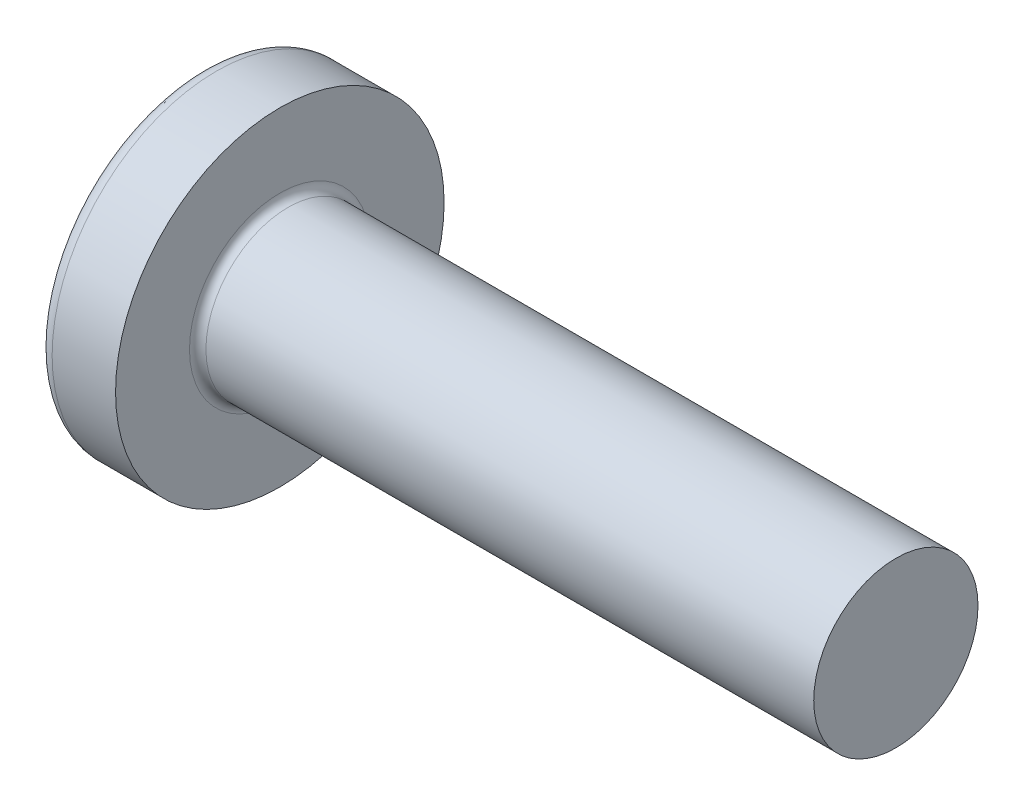
ISO-10303-21;
HEADER;
FILE_DESCRIPTION(('STEP AP214'),'2;1');
FILE_NAME('part.step','',(''),(''),'','','');
FILE_SCHEMA(('AUTOMOTIVE_DESIGN { 1 0 10303 214 1 1 1 1 }'));
ENDSEC;
DATA;
#1=APPLICATION_CONTEXT('core data for automotive mechanical design processes');
#2=APPLICATION_PROTOCOL_DEFINITION('international standard','automotive_design',2000,#1);
#3=PRODUCT_CONTEXT('',#1,'mechanical');
#4=PRODUCT('Part','Part','',(#3));
#5=PRODUCT_RELATED_PRODUCT_CATEGORY('part','',(#4));
#6=PRODUCT_DEFINITION_FORMATION('','',#4);
#7=PRODUCT_DEFINITION_CONTEXT('part definition',#1,'design');
#8=PRODUCT_DEFINITION('design','',#6,#7);
#9=PRODUCT_DEFINITION_SHAPE('','',#8);
#10=(LENGTH_UNIT() NAMED_UNIT(*) SI_UNIT(.MILLI.,.METRE.));
#11=(NAMED_UNIT(*) PLANE_ANGLE_UNIT() SI_UNIT($,.RADIAN.));
#12=(NAMED_UNIT(*) SI_UNIT($,.STERADIAN.) SOLID_ANGLE_UNIT());
#13=UNCERTAINTY_MEASURE_WITH_UNIT(LENGTH_MEASURE(1.E-05),#10,'distance_accuracy_value','');
#14=(GEOMETRIC_REPRESENTATION_CONTEXT(3) GLOBAL_UNCERTAINTY_ASSIGNED_CONTEXT((#13)) GLOBAL_UNIT_ASSIGNED_CONTEXT((#10,
#11,#12)) REPRESENTATION_CONTEXT('',''));
#15=CARTESIAN_POINT('',(0.,0.,0.));
#16=DIRECTION('',(0.,0.,1.));
#17=DIRECTION('',(1.,0.,0.));
#18=AXIS2_PLACEMENT_3D('',#15,#16,#17);
#19=CARTESIAN_POINT('',(6.5,0.,0.));
#20=DIRECTION('',(-1.,0.,0.));
#21=DIRECTION('',(0.,1.,0.));
#22=AXIS2_PLACEMENT_3D('',#19,#20,#21);
#23=SPHERICAL_SURFACE('',#22,6.5);
#24=CARTESIAN_POINT('',(1.26538895452803,0.,0.));
#25=DIRECTION('',(-1.,0.,0.));
#26=DIRECTION('',(0.,0.,1.));
#27=AXIS2_PLACEMENT_3D('',#24,#25,#26);
#28=CIRCLE('',#27,3.85342019543974);
#29=CARTESIAN_POINT('',(1.26538895452803,0.,3.85342019543974));
#30=VERTEX_POINT('',#29);
#31=EDGE_CURVE('E356',#30,#30,#28,.T.);
#32=ORIENTED_EDGE('',*,*,#31,.T.);
#33=EDGE_LOOP('',(#32));
#34=FACE_BOUND('',#33,.T.);
#35=CARTESIAN_POINT('',(0.0788099820016241,0.,0.));
#36=DIRECTION('',(1.,0.,0.));
#37=DIRECTION('',(0.,0.,-1.));
#38=AXIS2_PLACEMENT_3D('',#35,#36,#37);
#39=CIRCLE('',#38,1.0091178091571);
#40=CARTESIAN_POINT('',(0.0788099820016238,-0.514999999999996,-0.867809744562728));
#41=VERTEX_POINT('',#40);
#42=CARTESIAN_POINT('',(0.0788099820016241,-0.867809744562729,-0.515));
#43=VERTEX_POINT('',#42);
#44=EDGE_CURVE('E236',#41,#43,#39,.F.);
#45=ORIENTED_EDGE('',*,*,#44,.F.);
#46=CARTESIAN_POINT('',(6.5,-0.515,0.));
#47=DIRECTION('',(0.,1.,0.));
#48=DIRECTION('',(0.,0.,1.));
#49=AXIS2_PLACEMENT_3D('',#46,#47,#48);
#50=CIRCLE('',#49,6.47956595768575);
#51=CARTESIAN_POINT('',(0.331830520157864,-0.514999999999992,-1.98455543332606));
#52=VERTEX_POINT('',#51);
#53=EDGE_CURVE('E345',#52,#41,#50,.T.);
#54=ORIENTED_EDGE('',*,*,#53,.F.);
#55=CARTESIAN_POINT('',(6.06443225879636,0.,0.873613881877686));
#56=DIRECTION('',(0.446197753347362,0.,-0.89493439139848));
#57=DIRECTION('',(-0.89493439139848,0.,-0.446197753347362));
#58=AXIS2_PLACEMENT_3D('',#55,#56,#57);
#59=CIRCLE('',#58,6.42628038045441);
#60=CARTESIAN_POINT('',(0.331830520157865,0.515000000000007,-1.98455543332606));
#61=VERTEX_POINT('',#60);
#62=EDGE_CURVE('E315',#52,#61,#59,.T.);
#63=ORIENTED_EDGE('',*,*,#62,.T.);
#64=CARTESIAN_POINT('',(6.5,0.515,0.));
#65=DIRECTION('',(0.,-1.,0.));
#66=DIRECTION('',(0.,0.,-1.));
#67=AXIS2_PLACEMENT_3D('',#64,#65,#66);
#68=CIRCLE('',#67,6.47956595768574);
#69=CARTESIAN_POINT('',(0.0788099820016253,0.515000000000003,-0.867809744562724));
#70=VERTEX_POINT('',#69);
#71=EDGE_CURVE('E351',#70,#61,#68,.T.);
#72=ORIENTED_EDGE('',*,*,#71,.F.);
#73=CARTESIAN_POINT('',(0.0788099820016241,0.867809744562719,-0.515));
#74=VERTEX_POINT('',#73);
#75=EDGE_CURVE('E242',#74,#70,#39,.F.);
#76=ORIENTED_EDGE('',*,*,#75,.F.);
#77=CARTESIAN_POINT('',(6.5,0.,-0.515));
#78=DIRECTION('',(0.,0.,1.));
#79=DIRECTION('',(1.,0.,0.));
#80=AXIS2_PLACEMENT_3D('',#77,#78,#79);
#81=CIRCLE('',#80,6.47956595768574);
#82=CARTESIAN_POINT('',(0.331830520157846,1.984555433326,-0.515));
#83=VERTEX_POINT('',#82);
#84=EDGE_CURVE('E410',#83,#74,#81,.T.);
#85=ORIENTED_EDGE('',*,*,#84,.F.);
#86=CARTESIAN_POINT('',(6.06443225879571,-0.873613881878621,0.));
#87=DIRECTION('',(0.44619775334751,0.894934391398406,0.));
#88=DIRECTION('',(-0.894934391398405,0.44619775334751,0.));
#89=AXIS2_PLACEMENT_3D('',#86,#87,#88);
#90=CIRCLE('',#89,6.42628038045425);
#91=CARTESIAN_POINT('',(0.331830520157847,1.984555433326,0.514999999999999));
#92=VERTEX_POINT('',#91);
#93=EDGE_CURVE('E414',#83,#92,#90,.T.);
#94=ORIENTED_EDGE('',*,*,#93,.T.);
#95=CARTESIAN_POINT('',(6.5,0.,0.515));
#96=DIRECTION('',(0.,0.,-1.));
#97=DIRECTION('',(0.,1.,0.));
#98=AXIS2_PLACEMENT_3D('',#95,#96,#97);
#99=CIRCLE('',#98,6.47956595768574);
#100=CARTESIAN_POINT('',(0.0788099820016241,0.867809744562719,0.515));
#101=VERTEX_POINT('',#100);
#102=EDGE_CURVE('E405',#101,#92,#99,.T.);
#103=ORIENTED_EDGE('',*,*,#102,.F.);
#104=CARTESIAN_POINT('',(0.0788099820016247,0.514999999999997,0.867809744562727));
#105=VERTEX_POINT('',#104);
#106=EDGE_CURVE('E241',#105,#101,#39,.F.);
#107=ORIENTED_EDGE('',*,*,#106,.F.);
#108=CARTESIAN_POINT('',(0.331830520157846,0.514999999999993,1.984555433326));
#109=VERTEX_POINT('',#108);
#110=EDGE_CURVE('E347',#109,#105,#68,.T.);
#111=ORIENTED_EDGE('',*,*,#110,.F.);
#112=CARTESIAN_POINT('',(6.06443225879571,0.,-0.87361388187862));
#113=DIRECTION('',(0.44619775334751,0.,0.894934391398406));
#114=DIRECTION('',(0.894934391398405,0.,-0.44619775334751));
#115=AXIS2_PLACEMENT_3D('',#112,#113,#114);
#116=CIRCLE('',#115,6.42628038045424);
#117=CARTESIAN_POINT('',(0.331830520157846,-0.515000000000006,1.984555433326));
#118=VERTEX_POINT('',#117);
#119=EDGE_CURVE('E59',#109,#118,#116,.T.);
#120=ORIENTED_EDGE('',*,*,#119,.T.);
#121=CARTESIAN_POINT('',(0.0788099820016244,-0.515000000000003,0.867809744562724));
#122=VERTEX_POINT('',#121);
#123=EDGE_CURVE('E342',#122,#118,#50,.T.);
#124=ORIENTED_EDGE('',*,*,#123,.F.);
#125=CARTESIAN_POINT('',(0.0788099820016241,-0.867809744562729,0.514999999999999));
#126=VERTEX_POINT('',#125);
#127=EDGE_CURVE('E282',#126,#122,#39,.F.);
#128=ORIENTED_EDGE('',*,*,#127,.F.);
#129=CARTESIAN_POINT('',(0.331830520157862,-1.98455543332606,0.514999999999999));
#130=VERTEX_POINT('',#129);
#131=EDGE_CURVE('E406',#130,#126,#99,.T.);
#132=ORIENTED_EDGE('',*,*,#131,.F.);
#133=CARTESIAN_POINT('',(6.06443225879636,0.873613881877685,0.));
#134=DIRECTION('',(0.446197753347362,-0.89493439139848,0.));
#135=DIRECTION('',(0.89493439139848,0.446197753347362,0.));
#136=AXIS2_PLACEMENT_3D('',#133,#134,#135);
#137=CIRCLE('',#136,6.42628038045441);
#138=CARTESIAN_POINT('',(0.331830520157863,-1.98455543332606,-0.515));
#139=VERTEX_POINT('',#138);
#140=EDGE_CURVE('E401',#130,#139,#137,.T.);
#141=ORIENTED_EDGE('',*,*,#140,.T.);
#142=EDGE_CURVE('E74',#43,#139,#81,.T.);
#143=ORIENTED_EDGE('',*,*,#142,.F.);
#144=EDGE_LOOP('',(#45,#54,#63,#72,#76,#85,#94,#103,#107,#111,#120,#124,#128,#132,#141,#143));
#145=FACE_BOUND('',#144,.T.);
#146=ADVANCED_FACE('F44',(#34,#145),#23,.T.);
#147=CARTESIAN_POINT('',(0.,2.15,-0.515));
#148=DIRECTION('',(0.,0.,1.));
#149=DIRECTION('',(1.,0.,0.));
#150=AXIS2_PLACEMENT_3D('',#147,#148,#149);
#151=PLANE('',#150);
#152=ORIENTED_EDGE('',*,*,#84,.T.);
#153=CARTESIAN_POINT('',(-1.51195208675156,0.994972220320188,-0.515));
#154=CARTESIAN_POINT('',(-1.20405981949279,0.970722016949958,-0.515));
#155=CARTESIAN_POINT('',(-0.896180907521173,0.946299109919651,-0.515));
#156=CARTESIAN_POINT('',(-0.280449079832185,0.896981122427851,-0.515));
#157=CARTESIAN_POINT('',(0.0274038344396874,0.872086023934883,-0.515));
#158=CARTESIAN_POINT('',(0.489146739515351,0.83429553519528,-0.515));
#159=CARTESIAN_POINT('',(0.643055047553846,0.821624058404092,-0.515));
#160=CARTESIAN_POINT('',(0.950856520197141,0.796108332639504,-0.515));
#161=CARTESIAN_POINT('',(1.10474968487868,0.783264084592465,-0.515));
#162=CARTESIAN_POINT('',(1.41251352095103,0.757376569093378,-0.515));
#163=CARTESIAN_POINT('',(1.56638419296577,0.744333309065218,-0.515));
#164=CARTESIAN_POINT('',(1.87410847343335,0.718013273188896,-0.515));
#165=CARTESIAN_POINT('',(2.02796208151372,0.704736492982792,-0.515));
#166=CARTESIAN_POINT('',(2.36455311890989,0.675386943006726,-0.515));
#167=CARTESIAN_POINT('',(2.54728562293342,0.659257575640986,-0.515));
#168=CARTESIAN_POINT('',(2.91270624109256,0.626517182479888,-0.515));
#169=CARTESIAN_POINT('',(3.09539435554038,0.609906160177238,-0.515));
#170=CARTESIAN_POINT('',(3.46069832191612,0.576073027116421,-0.515));
#171=CARTESIAN_POINT('',(3.64331417870068,0.558850968932727,-0.515));
#172=CARTESIAN_POINT('',(4.00847437496567,0.523604864540037,-0.515));
#173=CARTESIAN_POINT('',(4.19101871216888,0.505580794604253,-0.515));
#174=CARTESIAN_POINT('',(4.55606208157937,0.468429191666488,-0.515));
#175=CARTESIAN_POINT('',(4.73856107358022,0.449301262281854,-0.515));
#176=CARTESIAN_POINT('',(5.10337547353418,0.409473604748924,-0.515));
#177=CARTESIAN_POINT('',(5.28569089526422,0.38877400510607,-0.515));
#178=CARTESIAN_POINT('',(5.55897278495412,0.355828287527264,-0.515));
#179=CARTESIAN_POINT('',(5.65005277419686,0.344527918782738,-0.515));
#180=CARTESIAN_POINT('',(5.83209904103607,0.321075174263031,-0.515));
#181=CARTESIAN_POINT('',(5.92306532397915,0.308922840209686,-0.515));
#182=CARTESIAN_POINT('',(6.10486078872898,0.28342733445193,-0.515));
#183=CARTESIAN_POINT('',(6.1956899229938,0.270083817601714,-0.515));
#184=CARTESIAN_POINT('',(6.33172773785679,0.248701420809951,-0.515));
#185=CARTESIAN_POINT('',(6.37704304473344,0.241345446705304,-0.515));
#186=CARTESIAN_POINT('',(6.4675722520141,0.226018953559338,-0.515));
#187=CARTESIAN_POINT('',(6.51278614568083,0.218048394864476,-0.515));
#188=CARTESIAN_POINT('',(6.55793125759549,0.209691465274945,-0.515));
#189=B_SPLINE_CURVE_WITH_KNOTS('',3,(#153,#154,#155,#156,#157,#158,#159,#160,#161,#162,#163,
#164,#165,#166,#167,#168,#169,#170,#171,#172,#173,#174,#175,#176,#177,#178,#179,#180,#181,#182,
#183,#184,#185,#186,#187,#188),.UNSPECIFIED.,.F.,.F.,(4,2,2,2,2,2,2,2,2,2,2,2,2,2,2,2,2,4),(0.,
0.926537709781721,1.85311087258339,2.31639796016285,2.77968256468771,3.24294992902055,
3.70622594801777,4.25655436065378,4.80687878359543,5.35715597005738,5.90744944680718,
6.45794177197673,7.008389135274,7.28372117336899,7.55903973750591,7.83443833587749,
7.97216007460855,8.10989070671571),.UNSPECIFIED.);
#190=CARTESIAN_POINT('',(2.34,0.677477674908923,-0.515));
#191=VERTEX_POINT('',#190);
#192=EDGE_CURVE('E266',#74,#191,#189,.T.);
#193=ORIENTED_EDGE('',*,*,#192,.T.);
#194=DIRECTION('',(0.,1.,0.));
#195=VECTOR('',#194,1.);
#196=CARTESIAN_POINT('',(2.34,-0.983319232260985,-0.515));
#197=LINE('',#196,#195);
#198=CARTESIAN_POINT('',(2.34,0.9833192322605,-0.515));
#199=VERTEX_POINT('',#198);
#200=EDGE_CURVE('E384',#191,#199,#197,.T.);
#201=ORIENTED_EDGE('',*,*,#200,.T.);
#202=DIRECTION('',(0.894934391398405,-0.44619775334751,0.));
#203=VECTOR('',#202,1.);
#204=CARTESIAN_POINT('',(0.,2.15,-0.515));
#205=LINE('',#204,#203);
#206=EDGE_CURVE('E352',#83,#199,#205,.T.);
#207=ORIENTED_EDGE('',*,*,#206,.F.);
#208=EDGE_LOOP('',(#152,#193,#201,#207));
#209=FACE_BOUND('',#208,.T.);
#210=ADVANCED_FACE('F184',(#209),#151,.T.);
#211=CARTESIAN_POINT('',(2.34,-0.983319232260985,-0.515));
#212=VERTEX_POINT('',#211);
#213=CARTESIAN_POINT('',(2.34,-0.677477674908923,-0.515));
#214=VERTEX_POINT('',#213);
#215=EDGE_CURVE('E380',#212,#214,#197,.T.);
#216=ORIENTED_EDGE('',*,*,#215,.T.);
#217=CARTESIAN_POINT('',(-1.51195208675156,-0.994972220320188,-0.515));
#218=CARTESIAN_POINT('',(-1.20405981949279,-0.970722016949958,-0.515));
#219=CARTESIAN_POINT('',(-0.896180907521174,-0.946299109919651,-0.515));
#220=CARTESIAN_POINT('',(-0.280449079832186,-0.896981122427851,-0.515));
#221=CARTESIAN_POINT('',(0.0274038344396869,-0.872086023934883,-0.515));
#222=CARTESIAN_POINT('',(0.48914673951535,-0.83429553519528,-0.515));
#223=CARTESIAN_POINT('',(0.643055047553845,-0.821624058404092,-0.515));
#224=CARTESIAN_POINT('',(0.95085652019714,-0.796108332639504,-0.515));
#225=CARTESIAN_POINT('',(1.10474968487868,-0.783264084592466,-0.515));
#226=CARTESIAN_POINT('',(1.41251352095103,-0.757376569093378,-0.515));
#227=CARTESIAN_POINT('',(1.56638419296577,-0.744333309065218,-0.515));
#228=CARTESIAN_POINT('',(1.87410847343335,-0.718013273188896,-0.515));
#229=CARTESIAN_POINT('',(2.02796208151372,-0.704736492982792,-0.515));
#230=CARTESIAN_POINT('',(2.36455311890989,-0.675386943006726,-0.515));
#231=CARTESIAN_POINT('',(2.54728562293342,-0.659257575640986,-0.515));
#232=CARTESIAN_POINT('',(2.91270624109256,-0.626517182479888,-0.515));
#233=CARTESIAN_POINT('',(3.09539435554038,-0.609906160177238,-0.515));
#234=CARTESIAN_POINT('',(3.46069832191613,-0.576073027116421,-0.515));
#235=CARTESIAN_POINT('',(3.64331417870068,-0.558850968932727,-0.515));
#236=CARTESIAN_POINT('',(4.00847437496567,-0.523604864540037,-0.515));
#237=CARTESIAN_POINT('',(4.19101871216888,-0.505580794604253,-0.515));
#238=CARTESIAN_POINT('',(4.55606208157938,-0.468429191666487,-0.515));
#239=CARTESIAN_POINT('',(4.73856107358023,-0.449301262281853,-0.515));
#240=CARTESIAN_POINT('',(5.10337547353419,-0.409473604748924,-0.515));
#241=CARTESIAN_POINT('',(5.28569089526422,-0.388774005106069,-0.515));
#242=CARTESIAN_POINT('',(5.55897278495412,-0.355828287527264,-0.515));
#243=CARTESIAN_POINT('',(5.65005277419686,-0.344527918782738,-0.515));
#244=CARTESIAN_POINT('',(5.83209904103608,-0.321075174263031,-0.515));
#245=CARTESIAN_POINT('',(5.92306532397915,-0.308922840209686,-0.515));
#246=CARTESIAN_POINT('',(6.10486078872898,-0.28342733445193,-0.515));
#247=CARTESIAN_POINT('',(6.1956899229938,-0.270083817601714,-0.515));
#248=CARTESIAN_POINT('',(6.33172773785679,-0.248701420809951,-0.515));
#249=CARTESIAN_POINT('',(6.37704304473344,-0.241345446705304,-0.515));
#250=CARTESIAN_POINT('',(6.4675722520141,-0.226018953559337,-0.515));
#251=CARTESIAN_POINT('',(6.51278614568083,-0.218048394864476,-0.515));
#252=CARTESIAN_POINT('',(6.55793125759549,-0.209691465274944,-0.515));
#253=B_SPLINE_CURVE_WITH_KNOTS('',3,(#217,#218,#219,#220,#221,#222,#223,#224,#225,#226,#227,
#228,#229,#230,#231,#232,#233,#234,#235,#236,#237,#238,#239,#240,#241,#242,#243,#244,#245,#246,
#247,#248,#249,#250,#251,#252),.UNSPECIFIED.,.F.,.F.,(4,2,2,2,2,2,2,2,2,2,2,2,2,2,2,2,2,4),(0.,
0.926537709781721,1.85311087258339,2.31639796016285,2.77968256468771,3.24294992902054,
3.70622594801777,4.25655436065378,4.80687878359544,5.35715597005738,5.90744944680718,
6.45794177197673,7.008389135274,7.28372117336899,7.55903973750591,7.83443833587749,
7.97216007460855,8.10989070671571),.UNSPECIFIED.);
#254=EDGE_CURVE('E240',#214,#43,#253,.F.);
#255=ORIENTED_EDGE('',*,*,#254,.T.);
#256=ORIENTED_EDGE('',*,*,#142,.T.);
#257=DIRECTION('',(0.894934391398479,0.446197753347362,0.));
#258=VECTOR('',#257,1.);
#259=CARTESIAN_POINT('',(0.,-2.15,-0.515));
#260=LINE('',#259,#258);
#261=EDGE_CURVE('E360',#139,#212,#260,.T.);
#262=ORIENTED_EDGE('',*,*,#261,.T.);
#263=EDGE_LOOP('',(#216,#255,#256,#262));
#264=FACE_BOUND('',#263,.T.);
#265=ADVANCED_FACE('F190',(#264),#151,.T.);
#266=CARTESIAN_POINT('',(0.,-2.15,0.514999999999999));
#267=DIRECTION('',(0.,0.,-1.));
#268=DIRECTION('',(0.,1.,0.));
#269=AXIS2_PLACEMENT_3D('',#266,#267,#268);
#270=PLANE('',#269);
#271=DIRECTION('',(0.,-1.,0.));
#272=VECTOR('',#271,1.);
#273=CARTESIAN_POINT('',(2.34,0.9833192322605,0.515));
#274=LINE('',#273,#272);
#275=CARTESIAN_POINT('',(2.34,0.9833192322605,0.515));
#276=VERTEX_POINT('',#275);
#277=CARTESIAN_POINT('',(2.34,0.677477674908923,0.515));
#278=VERTEX_POINT('',#277);
#279=EDGE_CURVE('E371',#276,#278,#274,.T.);
#280=ORIENTED_EDGE('',*,*,#279,.T.);
#281=CARTESIAN_POINT('',(-1.51195208754037,0.994972220382298,0.514999999999999));
#282=CARTESIAN_POINT('',(-1.20405982018868,0.970722017005064,0.514999999999999));
#283=CARTESIAN_POINT('',(-0.896180908124144,0.946299109967689,0.514999999999999));
#284=CARTESIAN_POINT('',(-0.280449080249312,0.896981122461527,0.515));
#285=CARTESIAN_POINT('',(0.0274038341154852,0.872086023961265,0.515));
#286=CARTESIAN_POINT('',(0.489146739371409,0.834295535207136,0.515));
#287=CARTESIAN_POINT('',(0.643055047497245,0.821624058408796,0.515));
#288=CARTESIAN_POINT('',(0.950856520315204,0.796108332629706,0.515));
#289=CARTESIAN_POINT('',(1.10474968508407,0.783264084575318,0.515));
#290=CARTESIAN_POINT('',(1.41251352133103,0.757376569061287,0.515));
#291=CARTESIAN_POINT('',(1.56638419343305,0.744333309025534,0.515));
#292=CARTESIAN_POINT('',(1.87410847407519,0.718013273133716,0.515));
#293=CARTESIAN_POINT('',(2.02796208224283,0.70473649291971,0.515));
#294=CARTESIAN_POINT('',(2.36455311972626,0.675386942934956,0.515));
#295=CARTESIAN_POINT('',(2.5472856237498,0.659257575568568,0.515));
#296=CARTESIAN_POINT('',(2.91270624190895,0.626517182406014,0.515));
#297=CARTESIAN_POINT('',(3.09539435635676,0.609906160102555,0.515));
#298=CARTESIAN_POINT('',(3.46069832273244,0.576073027039889,0.515));
#299=CARTESIAN_POINT('',(3.64331417951694,0.558850968855157,0.515));
#300=CARTESIAN_POINT('',(4.00847437578178,0.523604864460044,0.515));
#301=CARTESIAN_POINT('',(4.1910187129849,0.505580794522876,0.515));
#302=CARTESIAN_POINT('',(4.55606208239526,0.46842919158178,0.515));
#303=CARTESIAN_POINT('',(4.73856107439606,0.449301262195198,0.515));
#304=CARTESIAN_POINT('',(5.10337547434977,0.409473604657435,0.515));
#305=CARTESIAN_POINT('',(5.28569089607961,0.388774005011695,0.515));
#306=CARTESIAN_POINT('',(5.55897278576906,0.355828287427082,0.515));
#307=CARTESIAN_POINT('',(5.65005277501166,0.344527918680368,0.515));
#308=CARTESIAN_POINT('',(5.83209904185046,0.321075174155499,0.515));
#309=CARTESIAN_POINT('',(5.92306532479326,0.30892284009918,0.515));
#310=CARTESIAN_POINT('',(6.10486078954238,0.283427334334152,0.515));
#311=CARTESIAN_POINT('',(6.19568992380676,0.270083817479637,0.515));
#312=CARTESIAN_POINT('',(6.33172773866874,0.248701420679479,0.515));
#313=CARTESIAN_POINT('',(6.377043045545,0.241345446571707,0.515));
#314=CARTESIAN_POINT('',(6.46757225282466,0.226018953418423,0.515));
#315=CARTESIAN_POINT('',(6.51278614649077,0.218048394719368,0.515));
#316=CARTESIAN_POINT('',(6.55793125840465,0.209691465124901,0.515));
#317=B_SPLINE_CURVE_WITH_KNOTS('',3,(#281,#282,#283,#284,#285,#286,#287,#288,#289,#290,#291,
#292,#293,#294,#295,#296,#297,#298,#299,#300,#301,#302,#303,#304,#305,#306,#307,#308,#309,#310,
#311,#312,#313,#314,#315,#316),.UNSPECIFIED.,.F.,.F.,(4,2,2,2,2,2,2,2,2,2,2,2,2,2,2,2,2,4),(0.,
0.926537710061278,1.85311087314258,2.31639796098494,2.77968256577269,3.24294993036838,
3.70622594962848,4.25655436226469,4.80687878520654,5.3571559716686,5.90744944841855,
6.45794177358856,7.00838913688619,7.28372117498157,7.55903973911884,7.83443833749096,
7.97216007622236,8.1098907083299),.UNSPECIFIED.);
#318=EDGE_CURVE('E439',#278,#101,#317,.F.);
#319=ORIENTED_EDGE('',*,*,#318,.T.);
#320=ORIENTED_EDGE('',*,*,#102,.T.);
#321=DIRECTION('',(0.894934391398405,-0.44619775334751,0.));
#322=VECTOR('',#321,1.);
#323=CARTESIAN_POINT('',(0.,2.15,0.515));
#324=LINE('',#323,#322);
#325=EDGE_CURVE('E357',#92,#276,#324,.T.);
#326=ORIENTED_EDGE('',*,*,#325,.T.);
#327=EDGE_LOOP('',(#280,#319,#320,#326));
#328=FACE_BOUND('',#327,.T.);
#329=ADVANCED_FACE('F263',(#328),#270,.T.);
#330=ORIENTED_EDGE('',*,*,#131,.T.);
#331=CARTESIAN_POINT('',(-1.51195208754037,-0.994972220382298,0.514999999999999));
#332=CARTESIAN_POINT('',(-1.20405982018868,-0.970722017005064,0.514999999999999));
#333=CARTESIAN_POINT('',(-0.896180908124144,-0.946299109967689,0.514999999999999));
#334=CARTESIAN_POINT('',(-0.280449080249313,-0.896981122461527,0.514999999999999));
#335=CARTESIAN_POINT('',(0.0274038341154845,-0.872086023961265,0.514999999999999));
#336=CARTESIAN_POINT('',(0.489146739371408,-0.834295535207137,0.514999999999999));
#337=CARTESIAN_POINT('',(0.643055047497244,-0.821624058408796,0.514999999999999));
#338=CARTESIAN_POINT('',(0.950856520315203,-0.796108332629706,0.514999999999999));
#339=CARTESIAN_POINT('',(1.10474968508407,-0.783264084575318,0.514999999999999));
#340=CARTESIAN_POINT('',(1.41251352133103,-0.757376569061287,0.514999999999999));
#341=CARTESIAN_POINT('',(1.56638419343305,-0.744333309025534,0.515));
#342=CARTESIAN_POINT('',(1.87410847407519,-0.718013273133716,0.515));
#343=CARTESIAN_POINT('',(2.02796208224283,-0.70473649291971,0.515));
#344=CARTESIAN_POINT('',(2.36455311972626,-0.675386942934956,0.515));
#345=CARTESIAN_POINT('',(2.5472856237498,-0.659257575568568,0.515));
#346=CARTESIAN_POINT('',(2.91270624190895,-0.626517182406014,0.515));
#347=CARTESIAN_POINT('',(3.09539435635676,-0.609906160102555,0.515));
#348=CARTESIAN_POINT('',(3.46069832273244,-0.576073027039889,0.515));
#349=CARTESIAN_POINT('',(3.64331417951694,-0.558850968855157,0.515));
#350=CARTESIAN_POINT('',(4.00847437578178,-0.523604864460044,0.515));
#351=CARTESIAN_POINT('',(4.1910187129849,-0.505580794522876,0.515));
#352=CARTESIAN_POINT('',(4.55606208239526,-0.46842919158178,0.515));
#353=CARTESIAN_POINT('',(4.73856107439606,-0.449301262195198,0.515));
#354=CARTESIAN_POINT('',(5.10337547434977,-0.409473604657435,0.515));
#355=CARTESIAN_POINT('',(5.28569089607961,-0.388774005011695,0.515));
#356=CARTESIAN_POINT('',(5.55897278576906,-0.355828287427082,0.515));
#357=CARTESIAN_POINT('',(5.65005277501166,-0.344527918680369,0.515));
#358=CARTESIAN_POINT('',(5.83209904185046,-0.3210751741555,0.515));
#359=CARTESIAN_POINT('',(5.92306532479326,-0.308922840099181,0.515));
#360=CARTESIAN_POINT('',(6.10486078954238,-0.283427334334153,0.515));
#361=CARTESIAN_POINT('',(6.19568992380676,-0.270083817479637,0.515));
#362=CARTESIAN_POINT('',(6.33172773866873,-0.248701420679479,0.515));
#363=CARTESIAN_POINT('',(6.37704304554499,-0.241345446571707,0.515));
#364=CARTESIAN_POINT('',(6.46757225282465,-0.226018953418423,0.515));
#365=CARTESIAN_POINT('',(6.51278614649077,-0.218048394719369,0.515));
#366=CARTESIAN_POINT('',(6.55793125840465,-0.209691465124902,0.515));
#367=B_SPLINE_CURVE_WITH_KNOTS('',3,(#331,#332,#333,#334,#335,#336,#337,#338,#339,#340,#341,
#342,#343,#344,#345,#346,#347,#348,#349,#350,#351,#352,#353,#354,#355,#356,#357,#358,#359,#360,
#361,#362,#363,#364,#365,#366),.UNSPECIFIED.,.F.,.F.,(4,2,2,2,2,2,2,2,2,2,2,2,2,2,2,2,2,4),(0.,
0.926537710061278,1.85311087314258,2.31639796098494,2.77968256577269,3.24294993036838,
3.70622594962848,4.2565543622647,4.80687878520654,5.3571559716686,5.90744944841855,
6.45794177358856,7.00838913688619,7.28372117498157,7.55903973911884,7.83443833749096,
7.97216007622236,8.10989070832989),.UNSPECIFIED.);
#368=CARTESIAN_POINT('',(2.34,-0.677477674908923,0.515));
#369=VERTEX_POINT('',#368);
#370=EDGE_CURVE('E283',#126,#369,#367,.T.);
#371=ORIENTED_EDGE('',*,*,#370,.T.);
#372=CARTESIAN_POINT('',(2.34,-0.983319232260985,0.515));
#373=VERTEX_POINT('',#372);
#374=EDGE_CURVE('E375',#369,#373,#274,.T.);
#375=ORIENTED_EDGE('',*,*,#374,.T.);
#376=DIRECTION('',(0.89493439139848,0.446197753347362,0.));
#377=VECTOR('',#376,1.);
#378=CARTESIAN_POINT('',(0.,-2.15,0.514999999999999));
#379=LINE('',#378,#377);
#380=EDGE_CURVE('E363',#130,#373,#379,.T.);
#381=ORIENTED_EDGE('',*,*,#380,.F.);
#382=EDGE_LOOP('',(#330,#371,#375,#381));
#383=FACE_BOUND('',#382,.T.);
#384=ADVANCED_FACE('F507',(#383),#270,.T.);
#385=CARTESIAN_POINT('',(2.34,0.9833192322605,-0.515));
#386=DIRECTION('',(-1.,0.,0.));
#387=DIRECTION('',(0.,0.,1.));
#388=AXIS2_PLACEMENT_3D('',#385,#386,#387);
#389=PLANE('',#388);
#390=ORIENTED_EDGE('',*,*,#374,.F.);
#391=CARTESIAN_POINT('',(2.34,0.,0.));
#392=DIRECTION('',(-1.,0.,0.));
#393=DIRECTION('',(0.,0.,1.));
#394=AXIS2_PLACEMENT_3D('',#391,#392,#393);
#395=CIRCLE('',#394,0.851);
#396=EDGE_CURVE('E475',#214,#369,#395,.T.);
#397=ORIENTED_EDGE('',*,*,#396,.F.);
#398=ORIENTED_EDGE('',*,*,#215,.F.);
#399=DIRECTION('',(0.,0.,1.));
#400=VECTOR('',#399,1.);
#401=CARTESIAN_POINT('',(2.34,-0.983319232260985,-0.515));
#402=LINE('',#401,#400);
#403=EDGE_CURVE('E367',#212,#373,#402,.T.);
#404=ORIENTED_EDGE('',*,*,#403,.T.);
#405=EDGE_LOOP('',(#390,#397,#398,#404));
#406=FACE_BOUND('',#405,.T.);
#407=ADVANCED_FACE('F510',(#406),#389,.T.);
#408=DIRECTION('',(0.,0.,-1.));
#409=VECTOR('',#408,1.);
#410=CARTESIAN_POINT('',(2.34,-0.515000000000003,0.983319232260498));
#411=LINE('',#410,#409);
#412=CARTESIAN_POINT('',(2.34,-0.514999999999997,-0.677477674908925));
#413=VERTEX_POINT('',#412);
#414=CARTESIAN_POINT('',(2.34,-0.514999999999996,-0.983319232260987));
#415=VERTEX_POINT('',#414);
#416=EDGE_CURVE('E324',#413,#415,#411,.T.);
#417=ORIENTED_EDGE('',*,*,#416,.F.);
#418=CARTESIAN_POINT('',(2.34,0.515000000000002,-0.677477674908921));
#419=VERTEX_POINT('',#418);
#420=EDGE_CURVE('E66',#419,#413,#395,.T.);
#421=ORIENTED_EDGE('',*,*,#420,.F.);
#422=DIRECTION('',(0.,0.,1.));
#423=VECTOR('',#422,1.);
#424=CARTESIAN_POINT('',(2.34,0.515000000000004,-0.983319232260983));
#425=LINE('',#424,#423);
#426=CARTESIAN_POINT('',(2.34,0.515000000000004,-0.983319232260983));
#427=VERTEX_POINT('',#426);
#428=EDGE_CURVE('E326',#427,#419,#425,.T.);
#429=ORIENTED_EDGE('',*,*,#428,.F.);
#430=DIRECTION('',(0.,-1.,0.));
#431=VECTOR('',#430,1.);
#432=CARTESIAN_POINT('',(2.34,0.515000000000004,-0.983319232260983));
#433=LINE('',#432,#431);
#434=EDGE_CURVE('E312',#427,#415,#433,.T.);
#435=ORIENTED_EDGE('',*,*,#434,.T.);
#436=EDGE_LOOP('',(#417,#421,#429,#435));
#437=FACE_BOUND('',#436,.T.);
#438=ADVANCED_FACE('F323',(#437),#389,.T.);
#439=ORIENTED_EDGE('',*,*,#200,.F.);
#440=EDGE_CURVE('E237',#278,#191,#395,.T.);
#441=ORIENTED_EDGE('',*,*,#440,.F.);
#442=ORIENTED_EDGE('',*,*,#279,.F.);
#443=DIRECTION('',(0.,0.,-1.));
#444=VECTOR('',#443,1.);
#445=CARTESIAN_POINT('',(2.34,0.9833192322605,0.515));
#446=LINE('',#445,#444);
#447=EDGE_CURVE('E376',#276,#199,#446,.T.);
#448=ORIENTED_EDGE('',*,*,#447,.T.);
#449=EDGE_LOOP('',(#439,#441,#442,#448));
#450=FACE_BOUND('',#449,.T.);
#451=ADVANCED_FACE('F466',(#450),#389,.T.);
#452=CARTESIAN_POINT('',(0.,0.514999999999993,2.15));
#453=DIRECTION('',(0.,-1.,0.));
#454=DIRECTION('',(1.,0.,0.));
#455=AXIS2_PLACEMENT_3D('',#452,#453,#454);
#456=PLANE('',#455);
#457=ORIENTED_EDGE('',*,*,#110,.T.);
#458=CARTESIAN_POINT('',(-1.51195208754037,0.514999999999997,0.994972220382299));
#459=CARTESIAN_POINT('',(-1.20405982018868,0.514999999999997,0.970722017005065));
#460=CARTESIAN_POINT('',(-0.896180908124144,0.514999999999997,0.94629910996769));
#461=CARTESIAN_POINT('',(-0.280449080249312,0.514999999999997,0.896981122461529));
#462=CARTESIAN_POINT('',(0.0274038341154854,0.514999999999997,0.872086023961266));
#463=CARTESIAN_POINT('',(0.489146739371408,0.514999999999997,0.834295535207138));
#464=CARTESIAN_POINT('',(0.643055047497245,0.514999999999997,0.821624058408798));
#465=CARTESIAN_POINT('',(0.950856520315203,0.514999999999997,0.796108332629707));
#466=CARTESIAN_POINT('',(1.10474968508407,0.514999999999997,0.783264084575319));
#467=CARTESIAN_POINT('',(1.41251352133103,0.514999999999997,0.757376569061289));
#468=CARTESIAN_POINT('',(1.56638419343305,0.514999999999997,0.744333309025536));
#469=CARTESIAN_POINT('',(1.87410847407519,0.514999999999998,0.718013273133718));
#470=CARTESIAN_POINT('',(2.02796208224283,0.514999999999998,0.704736492919711));
#471=CARTESIAN_POINT('',(2.36455311972626,0.514999999999998,0.675386942934957));
#472=CARTESIAN_POINT('',(2.5472856237498,0.514999999999998,0.65925757556857));
#473=CARTESIAN_POINT('',(2.91270624190895,0.514999999999998,0.626517182406015));
#474=CARTESIAN_POINT('',(3.09539435635676,0.514999999999998,0.609906160102556));
#475=CARTESIAN_POINT('',(3.46069832273244,0.514999999999998,0.576073027039891));
#476=CARTESIAN_POINT('',(3.64331417951694,0.514999999999998,0.558850968855158));
#477=CARTESIAN_POINT('',(4.00847437578178,0.514999999999998,0.523604864460046));
#478=CARTESIAN_POINT('',(4.1910187129849,0.514999999999998,0.505580794522878));
#479=CARTESIAN_POINT('',(4.55606208239526,0.514999999999998,0.468429191581782));
#480=CARTESIAN_POINT('',(4.73856107439606,0.514999999999999,0.4493012621952));
#481=CARTESIAN_POINT('',(5.10337547434977,0.514999999999999,0.409473604657437));
#482=CARTESIAN_POINT('',(5.28569089607961,0.514999999999999,0.388774005011697));
#483=CARTESIAN_POINT('',(5.55897278576906,0.514999999999999,0.355828287427084));
#484=CARTESIAN_POINT('',(5.65005277501166,0.514999999999999,0.344527918680371));
#485=CARTESIAN_POINT('',(5.83209904185046,0.514999999999999,0.321075174155502));
#486=CARTESIAN_POINT('',(5.92306532479326,0.514999999999999,0.308922840099183));
#487=CARTESIAN_POINT('',(6.10486078954238,0.514999999999999,0.283427334334155));
#488=CARTESIAN_POINT('',(6.19568992380676,0.514999999999999,0.27008381747964));
#489=CARTESIAN_POINT('',(6.33172773866873,0.514999999999999,0.248701420679482));
#490=CARTESIAN_POINT('',(6.37704304554499,0.514999999999999,0.24134544657171));
#491=CARTESIAN_POINT('',(6.46757225282465,0.514999999999999,0.226018953418426));
#492=CARTESIAN_POINT('',(6.51278614649077,0.514999999999999,0.218048394719371));
#493=CARTESIAN_POINT('',(6.55793125840465,0.514999999999999,0.209691465124904));
#494=B_SPLINE_CURVE_WITH_KNOTS('',3,(#458,#459,#460,#461,#462,#463,#464,#465,#466,#467,#468,
#469,#470,#471,#472,#473,#474,#475,#476,#477,#478,#479,#480,#481,#482,#483,#484,#485,#486,#487,
#488,#489,#490,#491,#492,#493),.UNSPECIFIED.,.F.,.F.,(4,2,2,2,2,2,2,2,2,2,2,2,2,2,2,2,2,4),(0.,
0.926537710061278,1.85311087314258,2.31639796098494,2.77968256577269,3.24294993036838,
3.70622594962848,4.25655436226469,4.80687878520654,5.3571559716686,5.90744944841855,
6.45794177358856,7.00838913688619,7.28372117498157,7.55903973911884,7.83443833749095,
7.97216007622235,8.10989070832989),.UNSPECIFIED.);
#495=CARTESIAN_POINT('',(2.34,0.514999999999998,0.677477674908924));
#496=VERTEX_POINT('',#495);
#497=EDGE_CURVE('E490',#105,#496,#494,.T.);
#498=ORIENTED_EDGE('',*,*,#497,.T.);
#499=CARTESIAN_POINT('',(2.34,0.514999999999997,0.983319232260502));
#500=VERTEX_POINT('',#499);
#501=EDGE_CURVE('E341',#496,#500,#425,.T.);
#502=ORIENTED_EDGE('',*,*,#501,.T.);
#503=DIRECTION('',(0.894934391398405,0.,-0.44619775334751));
#504=VECTOR('',#503,1.);
#505=CARTESIAN_POINT('',(0.,0.514999999999993,2.15));
#506=LINE('',#505,#504);
#507=EDGE_CURVE('E346',#109,#500,#506,.T.);
#508=ORIENTED_EDGE('',*,*,#507,.F.);
#509=EDGE_LOOP('',(#457,#498,#502,#508));
#510=FACE_BOUND('',#509,.T.);
#511=ADVANCED_FACE('F291',(#510),#456,.T.);
#512=CARTESIAN_POINT('',(0.,-0.514999999999992,-2.15));
#513=DIRECTION('',(0.,1.,0.));
#514=DIRECTION('',(0.,0.,1.));
#515=AXIS2_PLACEMENT_3D('',#512,#513,#514);
#516=PLANE('',#515);
#517=CARTESIAN_POINT('',(2.34,-0.515000000000003,0.983319232260498));
#518=VERTEX_POINT('',#517);
#519=CARTESIAN_POINT('',(2.34,-0.515000000000002,0.677477674908921));
#520=VERTEX_POINT('',#519);
#521=EDGE_CURVE('E328',#518,#520,#411,.T.);
#522=ORIENTED_EDGE('',*,*,#521,.T.);
#523=CARTESIAN_POINT('',(-1.51195208675156,-0.515000000000003,0.994972220320186));
#524=CARTESIAN_POINT('',(-1.20405981949279,-0.515000000000003,0.970722016949956));
#525=CARTESIAN_POINT('',(-0.896180907521174,-0.515000000000003,0.946299109919649));
#526=CARTESIAN_POINT('',(-0.280449079832186,-0.515000000000003,0.89698112242785));
#527=CARTESIAN_POINT('',(0.0274038344396867,-0.515000000000003,0.872086023934881));
#528=CARTESIAN_POINT('',(0.48914673951535,-0.515000000000003,0.834295535195279));
#529=CARTESIAN_POINT('',(0.643055047553846,-0.515000000000003,0.821624058404091));
#530=CARTESIAN_POINT('',(0.95085652019714,-0.515000000000003,0.796108332639503));
#531=CARTESIAN_POINT('',(1.10474968487868,-0.515000000000002,0.783264084592464));
#532=CARTESIAN_POINT('',(1.41251352095103,-0.515000000000002,0.757376569093377));
#533=CARTESIAN_POINT('',(1.56638419296577,-0.515000000000002,0.744333309065217));
#534=CARTESIAN_POINT('',(1.87410847343335,-0.515000000000002,0.718013273188894));
#535=CARTESIAN_POINT('',(2.02796208151372,-0.515000000000002,0.70473649298279));
#536=CARTESIAN_POINT('',(2.36455311890989,-0.515000000000002,0.675386943006725));
#537=CARTESIAN_POINT('',(2.54728562293342,-0.515000000000002,0.659257575640984));
#538=CARTESIAN_POINT('',(2.91270624109256,-0.515000000000002,0.626517182479886));
#539=CARTESIAN_POINT('',(3.09539435554038,-0.515000000000002,0.609906160177236));
#540=CARTESIAN_POINT('',(3.46069832191613,-0.515000000000002,0.57607302711642));
#541=CARTESIAN_POINT('',(3.64331417870068,-0.515000000000002,0.558850968932726));
#542=CARTESIAN_POINT('',(4.00847437496567,-0.515000000000002,0.523604864540035));
#543=CARTESIAN_POINT('',(4.19101871216888,-0.515000000000002,0.505580794604251));
#544=CARTESIAN_POINT('',(4.55606208157937,-0.515000000000002,0.468429191666486));
#545=CARTESIAN_POINT('',(4.73856107358023,-0.515000000000002,0.449301262281852));
#546=CARTESIAN_POINT('',(5.10337547353419,-0.515000000000002,0.409473604748922));
#547=CARTESIAN_POINT('',(5.28569089526422,-0.515000000000002,0.388774005106068));
#548=CARTESIAN_POINT('',(5.55897278495412,-0.515000000000001,0.355828287527262));
#549=CARTESIAN_POINT('',(5.65005277419686,-0.515000000000001,0.344527918782736));
#550=CARTESIAN_POINT('',(5.83209904103608,-0.515000000000001,0.321075174263029));
#551=CARTESIAN_POINT('',(5.92306532397915,-0.515000000000001,0.308922840209684));
#552=CARTESIAN_POINT('',(6.10486078872898,-0.515000000000001,0.283427334451928));
#553=CARTESIAN_POINT('',(6.1956899229938,-0.515000000000001,0.270083817601712));
#554=CARTESIAN_POINT('',(6.33172773785679,-0.515000000000001,0.248701420809949));
#555=CARTESIAN_POINT('',(6.37704304473344,-0.515000000000001,0.241345446705302));
#556=CARTESIAN_POINT('',(6.4675722520141,-0.515000000000001,0.226018953559335));
#557=CARTESIAN_POINT('',(6.51278614568083,-0.515000000000001,0.218048394864474));
#558=CARTESIAN_POINT('',(6.55793125759549,-0.515000000000001,0.209691465274942));
#559=B_SPLINE_CURVE_WITH_KNOTS('',3,(#523,#524,#525,#526,#527,#528,#529,#530,#531,#532,#533,
#534,#535,#536,#537,#538,#539,#540,#541,#542,#543,#544,#545,#546,#547,#548,#549,#550,#551,#552,
#553,#554,#555,#556,#557,#558),.UNSPECIFIED.,.F.,.F.,(4,2,2,2,2,2,2,2,2,2,2,2,2,2,2,2,2,4),(0.,
0.926537709781721,1.85311087258339,2.31639796016285,2.77968256468771,3.24294992902054,
3.70622594801777,4.25655436065378,4.80687878359543,5.35715597005738,5.90744944680718,
6.45794177197673,7.008389135274,7.28372117336899,7.55903973750591,7.83443833587749,
7.97216007460855,8.10989070671571),.UNSPECIFIED.);
#560=EDGE_CURVE('E274',#520,#122,#559,.F.);
#561=ORIENTED_EDGE('',*,*,#560,.T.);
#562=ORIENTED_EDGE('',*,*,#123,.T.);
#563=DIRECTION('',(0.894934391398405,0.,-0.44619775334751));
#564=VECTOR('',#563,1.);
#565=CARTESIAN_POINT('',(0.,-0.515000000000007,2.15));
#566=LINE('',#565,#564);
#567=EDGE_CURVE('E430',#118,#518,#566,.T.);
#568=ORIENTED_EDGE('',*,*,#567,.T.);
#569=EDGE_LOOP('',(#522,#561,#562,#568));
#570=FACE_BOUND('',#569,.T.);
#571=ADVANCED_FACE('F219',(#570),#516,.T.);
#572=ORIENTED_EDGE('',*,*,#428,.T.);
#573=CARTESIAN_POINT('',(-1.51195208754037,0.515000000000004,-0.994972220382296));
#574=CARTESIAN_POINT('',(-1.20405982018868,0.515000000000003,-0.970722017005062));
#575=CARTESIAN_POINT('',(-0.896180908124144,0.515000000000003,-0.946299109967687));
#576=CARTESIAN_POINT('',(-0.280449080249312,0.515000000000003,-0.896981122461525));
#577=CARTESIAN_POINT('',(0.027403834115485,0.515000000000003,-0.872086023961263));
#578=CARTESIAN_POINT('',(0.489146739371408,0.515000000000003,-0.834295535207134));
#579=CARTESIAN_POINT('',(0.643055047497245,0.515000000000003,-0.821624058408794));
#580=CARTESIAN_POINT('',(0.950856520315203,0.515000000000003,-0.796108332629704));
#581=CARTESIAN_POINT('',(1.10474968508407,0.515000000000003,-0.783264084575315));
#582=CARTESIAN_POINT('',(1.41251352133103,0.515000000000003,-0.757376569061285));
#583=CARTESIAN_POINT('',(1.56638419343305,0.515000000000003,-0.744333309025532));
#584=CARTESIAN_POINT('',(1.87410847407519,0.515000000000003,-0.718013273133714));
#585=CARTESIAN_POINT('',(2.02796208224283,0.515000000000002,-0.704736492919708));
#586=CARTESIAN_POINT('',(2.36455311972626,0.515000000000002,-0.675386942934954));
#587=CARTESIAN_POINT('',(2.5472856237498,0.515000000000002,-0.659257575568566));
#588=CARTESIAN_POINT('',(2.91270624190895,0.515000000000002,-0.626517182406012));
#589=CARTESIAN_POINT('',(3.09539435635676,0.515000000000002,-0.609906160102553));
#590=CARTESIAN_POINT('',(3.46069832273244,0.515000000000002,-0.576073027039887));
#591=CARTESIAN_POINT('',(3.64331417951694,0.515000000000002,-0.558850968855155));
#592=CARTESIAN_POINT('',(4.00847437578178,0.515000000000002,-0.523604864460043));
#593=CARTESIAN_POINT('',(4.1910187129849,0.515000000000002,-0.505580794522874));
#594=CARTESIAN_POINT('',(4.55606208239526,0.515000000000002,-0.468429191581778));
#595=CARTESIAN_POINT('',(4.73856107439606,0.515000000000002,-0.449301262195196));
#596=CARTESIAN_POINT('',(5.10337547434977,0.515000000000001,-0.409473604657433));
#597=CARTESIAN_POINT('',(5.2856908960796,0.515000000000001,-0.388774005011694));
#598=CARTESIAN_POINT('',(5.55897278576906,0.515000000000001,-0.355828287427081));
#599=CARTESIAN_POINT('',(5.65005277501166,0.515000000000001,-0.344527918680367));
#600=CARTESIAN_POINT('',(5.83209904185046,0.515000000000001,-0.321075174155498));
#601=CARTESIAN_POINT('',(5.92306532479326,0.515000000000001,-0.308922840099179));
#602=CARTESIAN_POINT('',(6.10486078954238,0.515000000000001,-0.283427334334151));
#603=CARTESIAN_POINT('',(6.19568992380675,0.515000000000001,-0.270083817479636));
#604=CARTESIAN_POINT('',(6.33172773866873,0.515000000000001,-0.248701420679478));
#605=CARTESIAN_POINT('',(6.37704304554499,0.515000000000001,-0.241345446571706));
#606=CARTESIAN_POINT('',(6.46757225282465,0.515000000000001,-0.226018953418422));
#607=CARTESIAN_POINT('',(6.51278614649077,0.515000000000001,-0.218048394719368));
#608=CARTESIAN_POINT('',(6.55793125840465,0.515000000000001,-0.2096914651249));
#609=B_SPLINE_CURVE_WITH_KNOTS('',3,(#573,#574,#575,#576,#577,#578,#579,#580,#581,#582,#583,
#584,#585,#586,#587,#588,#589,#590,#591,#592,#593,#594,#595,#596,#597,#598,#599,#600,#601,#602,
#603,#604,#605,#606,#607,#608),.UNSPECIFIED.,.F.,.F.,(4,2,2,2,2,2,2,2,2,2,2,2,2,2,2,2,2,4),(0.,
0.926537710061278,1.85311087314258,2.31639796098494,2.77968256577269,3.24294993036838,
3.70622594962848,4.25655436226469,4.80687878520654,5.3571559716686,5.90744944841854,
6.45794177358856,7.00838913688618,7.28372117498157,7.55903973911884,7.83443833749096,
7.97216007622235,8.10989070832989),.UNSPECIFIED.);
#610=EDGE_CURVE('E249',#419,#70,#609,.F.);
#611=ORIENTED_EDGE('',*,*,#610,.T.);
#612=ORIENTED_EDGE('',*,*,#71,.T.);
#613=DIRECTION('',(0.894934391398479,0.,0.446197753347362));
#614=VECTOR('',#613,1.);
#615=CARTESIAN_POINT('',(0.,0.515000000000008,-2.15));
#616=LINE('',#615,#614);
#617=EDGE_CURVE('E319',#61,#427,#616,.T.);
#618=ORIENTED_EDGE('',*,*,#617,.T.);
#619=EDGE_LOOP('',(#572,#611,#612,#618));
#620=FACE_BOUND('',#619,.T.);
#621=ADVANCED_FACE('F217',(#620),#456,.T.);
#622=ORIENTED_EDGE('',*,*,#53,.T.);
#623=CARTESIAN_POINT('',(-1.51195208754037,-0.514999999999996,-0.9949722203823));
#624=CARTESIAN_POINT('',(-1.20405982018868,-0.514999999999996,-0.970722017005066));
#625=CARTESIAN_POINT('',(-0.896180908124144,-0.514999999999996,-0.946299109967691));
#626=CARTESIAN_POINT('',(-0.280449080249313,-0.514999999999996,-0.896981122461529));
#627=CARTESIAN_POINT('',(0.0274038341154846,-0.514999999999996,-0.872086023961267));
#628=CARTESIAN_POINT('',(0.489146739371408,-0.514999999999997,-0.834295535207138));
#629=CARTESIAN_POINT('',(0.643055047497244,-0.514999999999997,-0.821624058408798));
#630=CARTESIAN_POINT('',(0.950856520315203,-0.514999999999997,-0.796108332629708));
#631=CARTESIAN_POINT('',(1.10474968508407,-0.514999999999997,-0.783264084575319));
#632=CARTESIAN_POINT('',(1.41251352133103,-0.514999999999997,-0.757376569061289));
#633=CARTESIAN_POINT('',(1.56638419343305,-0.514999999999997,-0.744333309025536));
#634=CARTESIAN_POINT('',(1.87410847407519,-0.514999999999997,-0.718013273133718));
#635=CARTESIAN_POINT('',(2.02796208224283,-0.514999999999997,-0.704736492919712));
#636=CARTESIAN_POINT('',(2.36455311972626,-0.514999999999997,-0.675386942934958));
#637=CARTESIAN_POINT('',(2.5472856237498,-0.514999999999997,-0.65925757556857));
#638=CARTESIAN_POINT('',(2.91270624190895,-0.514999999999998,-0.626517182406016));
#639=CARTESIAN_POINT('',(3.09539435635676,-0.514999999999998,-0.609906160102557));
#640=CARTESIAN_POINT('',(3.46069832273244,-0.514999999999998,-0.576073027039891));
#641=CARTESIAN_POINT('',(3.64331417951694,-0.514999999999998,-0.558850968855159));
#642=CARTESIAN_POINT('',(4.00847437578178,-0.514999999999998,-0.523604864460046));
#643=CARTESIAN_POINT('',(4.1910187129849,-0.514999999999998,-0.505580794522878));
#644=CARTESIAN_POINT('',(4.55606208239526,-0.514999999999998,-0.468429191581782));
#645=CARTESIAN_POINT('',(4.73856107439606,-0.514999999999998,-0.4493012621952));
#646=CARTESIAN_POINT('',(5.10337547434977,-0.514999999999999,-0.409473604657437));
#647=CARTESIAN_POINT('',(5.28569089607961,-0.514999999999999,-0.388774005011697));
#648=CARTESIAN_POINT('',(5.55897278576906,-0.514999999999999,-0.355828287427084));
#649=CARTESIAN_POINT('',(5.65005277501166,-0.514999999999999,-0.344527918680371));
#650=CARTESIAN_POINT('',(5.83209904185046,-0.514999999999999,-0.321075174155502));
#651=CARTESIAN_POINT('',(5.92306532479326,-0.514999999999999,-0.308922840099183));
#652=CARTESIAN_POINT('',(6.10486078954238,-0.514999999999999,-0.283427334334154));
#653=CARTESIAN_POINT('',(6.19568992380676,-0.514999999999999,-0.270083817479639));
#654=CARTESIAN_POINT('',(6.33172773866873,-0.514999999999999,-0.248701420679481));
#655=CARTESIAN_POINT('',(6.37704304554499,-0.514999999999999,-0.241345446571709));
#656=CARTESIAN_POINT('',(6.46757225282465,-0.514999999999999,-0.226018953418425));
#657=CARTESIAN_POINT('',(6.51278614649077,-0.514999999999999,-0.218048394719371));
#658=CARTESIAN_POINT('',(6.55793125840465,-0.514999999999999,-0.209691465124903));
#659=B_SPLINE_CURVE_WITH_KNOTS('',3,(#623,#624,#625,#626,#627,#628,#629,#630,#631,#632,#633,
#634,#635,#636,#637,#638,#639,#640,#641,#642,#643,#644,#645,#646,#647,#648,#649,#650,#651,#652,
#653,#654,#655,#656,#657,#658),.UNSPECIFIED.,.F.,.F.,(4,2,2,2,2,2,2,2,2,2,2,2,2,2,2,2,2,4),(0.,
0.926537710061278,1.85311087314258,2.31639796098494,2.77968256577269,3.24294993036838,
3.70622594962848,4.25655436226469,4.80687878520654,5.3571559716686,5.90744944841855,
6.45794177358856,7.00838913688619,7.28372117498157,7.55903973911884,7.83443833749096,
7.97216007622236,8.10989070832989),.UNSPECIFIED.);
#660=EDGE_CURVE('E11',#41,#413,#659,.T.);
#661=ORIENTED_EDGE('',*,*,#660,.T.);
#662=ORIENTED_EDGE('',*,*,#416,.T.);
#663=DIRECTION('',(0.89493439139848,0.,0.446197753347362));
#664=VECTOR('',#663,1.);
#665=CARTESIAN_POINT('',(0.,-0.514999999999992,-2.15));
#666=LINE('',#665,#664);
#667=EDGE_CURVE('E309',#52,#415,#666,.T.);
#668=ORIENTED_EDGE('',*,*,#667,.F.);
#669=EDGE_LOOP('',(#622,#661,#662,#668));
#670=FACE_BOUND('',#669,.T.);
#671=ADVANCED_FACE('F212',(#670),#516,.T.);
#672=CARTESIAN_POINT('',(-25.4,0.,0.));
#673=DIRECTION('',(-1.,0.,0.));
#674=DIRECTION('',(0.,0.,1.));
#675=AXIS2_PLACEMENT_3D('',#672,#673,#674);
#676=CYLINDRICAL_SURFACE('',#675,2.);
#677=CARTESIAN_POINT('',(3.3,0.,0.));
#678=DIRECTION('',(-1.,0.,0.));
#679=DIRECTION('',(0.,0.,1.));
#680=AXIS2_PLACEMENT_3D('',#677,#678,#679);
#681=CIRCLE('',#680,2.);
#682=CARTESIAN_POINT('',(3.3,0.,2.));
#683=VERTEX_POINT('',#682);
#684=EDGE_CURVE('E223',#683,#683,#681,.F.);
#685=ORIENTED_EDGE('',*,*,#684,.T.);
#686=EDGE_LOOP('',(#685));
#687=FACE_BOUND('',#686,.T.);
#688=CARTESIAN_POINT('',(18.1,0.,0.));
#689=DIRECTION('',(1.,0.,0.));
#690=DIRECTION('',(0.,0.,-1.));
#691=AXIS2_PLACEMENT_3D('',#688,#689,#690);
#692=CIRCLE('',#691,2.);
#693=CARTESIAN_POINT('',(18.1,0.,-2.));
#694=VERTEX_POINT('',#693);
#695=EDGE_CURVE('E226',#694,#694,#692,.T.);
#696=ORIENTED_EDGE('',*,*,#695,.F.);
#697=EDGE_LOOP('',(#696));
#698=FACE_BOUND('',#697,.T.);
#699=ADVANCED_FACE('F209',(#687,#698),#676,.T.);
#700=CARTESIAN_POINT('',(3.1,2.,0.));
#701=DIRECTION('',(-1.,0.,0.));
#702=DIRECTION('',(0.,0.,1.));
#703=AXIS2_PLACEMENT_3D('',#700,#701,#702);
#704=PLANE('',#703);
#705=CARTESIAN_POINT('',(3.1,0.,0.));
#706=DIRECTION('',(-1.,0.,0.));
#707=DIRECTION('',(0.,0.,1.));
#708=AXIS2_PLACEMENT_3D('',#705,#706,#707);
#709=CIRCLE('',#708,2.2);
#710=CARTESIAN_POINT('',(3.1,0.,2.2));
#711=VERTEX_POINT('',#710);
#712=EDGE_CURVE('E395',#711,#711,#709,.T.);
#713=ORIENTED_EDGE('',*,*,#712,.T.);
#714=EDGE_LOOP('',(#713));
#715=FACE_BOUND('',#714,.T.);
#716=CARTESIAN_POINT('',(3.1,0.,0.));
#717=DIRECTION('',(-1.,0.,0.));
#718=DIRECTION('',(0.,0.,1.));
#719=AXIS2_PLACEMENT_3D('',#716,#717,#718);
#720=CIRCLE('',#719,4.);
#721=CARTESIAN_POINT('',(3.1,0.,4.));
#722=VERTEX_POINT('',#721);
#723=EDGE_CURVE('E391',#722,#722,#720,.T.);
#724=ORIENTED_EDGE('',*,*,#723,.F.);
#725=EDGE_LOOP('',(#724));
#726=FACE_BOUND('',#725,.T.);
#727=ADVANCED_FACE('F206',(#715,#726),#704,.F.);
#728=CARTESIAN_POINT('',(-25.4,0.,0.));
#729=DIRECTION('',(-1.,0.,0.));
#730=DIRECTION('',(0.,0.,1.));
#731=AXIS2_PLACEMENT_3D('',#728,#729,#730);
#732=CYLINDRICAL_SURFACE('',#731,4.);
#733=ORIENTED_EDGE('',*,*,#723,.T.);
#734=EDGE_LOOP('',(#733));
#735=FACE_BOUND('',#734,.T.);
#736=CARTESIAN_POINT('',(1.55530587396956,0.,0.));
#737=DIRECTION('',(-1.,0.,0.));
#738=DIRECTION('',(0.,0.,1.));
#739=AXIS2_PLACEMENT_3D('',#736,#737,#738);
#740=CIRCLE('',#739,4.);
#741=CARTESIAN_POINT('',(1.55530587396956,0.,4.));
#742=VERTEX_POINT('',#741);
#743=EDGE_CURVE('E387',#742,#742,#740,.T.);
#744=ORIENTED_EDGE('',*,*,#743,.F.);
#745=EDGE_LOOP('',(#744));
#746=FACE_BOUND('',#745,.T.);
#747=ADVANCED_FACE('F202',(#735,#746),#732,.T.);
#748=CARTESIAN_POINT('',(1.55530587396956,0.,0.));
#749=DIRECTION('',(-1.,0.,0.));
#750=DIRECTION('',(0.,0.,1.));
#751=AXIS2_PLACEMENT_3D('',#748,#749,#750);
#752=TOROIDAL_SURFACE('',#751,3.64,0.36);
#753=ORIENTED_EDGE('',*,*,#743,.T.);
#754=EDGE_LOOP('',(#753));
#755=FACE_BOUND('',#754,.T.);
#756=ORIENTED_EDGE('',*,*,#31,.F.);
#757=EDGE_LOOP('',(#756));
#758=FACE_BOUND('',#757,.T.);
#759=ADVANCED_FACE('F199',(#755,#758),#752,.T.);
#760=CARTESIAN_POINT('',(3.3,0.,0.));
#761=DIRECTION('',(-1.,0.,0.));
#762=DIRECTION('',(0.,0.,1.));
#763=AXIS2_PLACEMENT_3D('',#760,#761,#762);
#764=TOROIDAL_SURFACE('',#763,2.2,0.2);
#765=ORIENTED_EDGE('',*,*,#684,.F.);
#766=EDGE_LOOP('',(#765));
#767=FACE_BOUND('',#766,.T.);
#768=ORIENTED_EDGE('',*,*,#712,.F.);
#769=EDGE_LOOP('',(#768));
#770=FACE_BOUND('',#769,.T.);
#771=ADVANCED_FACE('F46',(#767,#770),#764,.F.);
#772=CARTESIAN_POINT('',(2.34,0.9833192322605,0.515));
#773=DIRECTION('',(0.44619775334751,0.894934391398406,0.));
#774=DIRECTION('',(-0.894934391398405,0.44619775334751,0.));
#775=AXIS2_PLACEMENT_3D('',#772,#773,#774);
#776=PLANE('',#775);
#777=ORIENTED_EDGE('',*,*,#206,.T.);
#778=ORIENTED_EDGE('',*,*,#447,.F.);
#779=ORIENTED_EDGE('',*,*,#325,.F.);
#780=ORIENTED_EDGE('',*,*,#93,.F.);
#781=EDGE_LOOP('',(#777,#778,#779,#780));
#782=FACE_BOUND('',#781,.T.);
#783=ADVANCED_FACE('F261',(#782),#776,.F.);
#784=CARTESIAN_POINT('',(0.,-2.15,-0.515));
#785=DIRECTION('',(0.446197753347362,-0.89493439139848,0.));
#786=DIRECTION('',(0.89493439139848,0.446197753347362,0.));
#787=AXIS2_PLACEMENT_3D('',#784,#785,#786);
#788=PLANE('',#787);
#789=ORIENTED_EDGE('',*,*,#380,.T.);
#790=ORIENTED_EDGE('',*,*,#403,.F.);
#791=ORIENTED_EDGE('',*,*,#261,.F.);
#792=ORIENTED_EDGE('',*,*,#140,.F.);
#793=EDGE_LOOP('',(#789,#790,#791,#792));
#794=FACE_BOUND('',#793,.T.);
#795=ADVANCED_FACE('F504',(#794),#788,.F.);
#796=ORIENTED_EDGE('',*,*,#501,.F.);
#797=EDGE_CURVE('E228',#520,#496,#395,.T.);
#798=ORIENTED_EDGE('',*,*,#797,.F.);
#799=ORIENTED_EDGE('',*,*,#521,.F.);
#800=DIRECTION('',(0.,1.,0.));
#801=VECTOR('',#800,1.);
#802=CARTESIAN_POINT('',(2.34,-0.515000000000003,0.983319232260498));
#803=LINE('',#802,#801);
#804=EDGE_CURVE('E335',#518,#500,#803,.T.);
#805=ORIENTED_EDGE('',*,*,#804,.T.);
#806=EDGE_LOOP('',(#796,#798,#799,#805));
#807=FACE_BOUND('',#806,.T.);
#808=ADVANCED_FACE('F197',(#807),#389,.T.);
#809=CARTESIAN_POINT('',(2.34,-0.515000000000003,0.983319232260498));
#810=DIRECTION('',(0.44619775334751,0.,0.894934391398406));
#811=DIRECTION('',(-0.894934391398405,0.,0.44619775334751));
#812=AXIS2_PLACEMENT_3D('',#809,#810,#811);
#813=PLANE('',#812);
#814=ORIENTED_EDGE('',*,*,#507,.T.);
#815=ORIENTED_EDGE('',*,*,#804,.F.);
#816=ORIENTED_EDGE('',*,*,#567,.F.);
#817=ORIENTED_EDGE('',*,*,#119,.F.);
#818=EDGE_LOOP('',(#814,#815,#816,#817));
#819=FACE_BOUND('',#818,.T.);
#820=ADVANCED_FACE('F297',(#819),#813,.F.);
#821=CARTESIAN_POINT('',(0.,0.515000000000008,-2.15));
#822=DIRECTION('',(0.446197753347362,0.,-0.89493439139848));
#823=DIRECTION('',(0.89493439139848,0.,0.446197753347362));
#824=AXIS2_PLACEMENT_3D('',#821,#822,#823);
#825=PLANE('',#824);
#826=ORIENTED_EDGE('',*,*,#667,.T.);
#827=ORIENTED_EDGE('',*,*,#434,.F.);
#828=ORIENTED_EDGE('',*,*,#617,.F.);
#829=ORIENTED_EDGE('',*,*,#62,.F.);
#830=EDGE_LOOP('',(#826,#827,#828,#829));
#831=FACE_BOUND('',#830,.T.);
#832=ADVANCED_FACE('F294',(#831),#825,.F.);
#833=CARTESIAN_POINT('',(2.34,0.,0.));
#834=DIRECTION('',(-1.,0.,0.));
#835=DIRECTION('',(0.,0.,1.));
#836=AXIS2_PLACEMENT_3D('',#833,#834,#835);
#837=CONICAL_SURFACE('',#836,0.851,0.0698131700797659);
#838=EDGE_CURVE('E233',#496,#278,#395,.T.);
#839=ORIENTED_EDGE('',*,*,#838,.F.);
#840=ORIENTED_EDGE('',*,*,#497,.F.);
#841=ORIENTED_EDGE('',*,*,#106,.T.);
#842=ORIENTED_EDGE('',*,*,#318,.F.);
#843=EDGE_LOOP('',(#839,#840,#841,#842));
#844=FACE_BOUND('',#843,.T.);
#845=ADVANCED_FACE('F181',(#844),#837,.F.);
#846=ORIENTED_EDGE('',*,*,#127,.T.);
#847=ORIENTED_EDGE('',*,*,#560,.F.);
#848=EDGE_CURVE('E231',#369,#520,#395,.T.);
#849=ORIENTED_EDGE('',*,*,#848,.F.);
#850=ORIENTED_EDGE('',*,*,#370,.F.);
#851=EDGE_LOOP('',(#846,#847,#849,#850));
#852=FACE_BOUND('',#851,.T.);
#853=ADVANCED_FACE('F303',(#852),#837,.F.);
#854=ORIENTED_EDGE('',*,*,#75,.T.);
#855=ORIENTED_EDGE('',*,*,#610,.F.);
#856=EDGE_CURVE('E470',#191,#419,#395,.T.);
#857=ORIENTED_EDGE('',*,*,#856,.F.);
#858=ORIENTED_EDGE('',*,*,#192,.F.);
#859=EDGE_LOOP('',(#854,#855,#857,#858));
#860=FACE_BOUND('',#859,.T.);
#861=ADVANCED_FACE('F179',(#860),#837,.F.);
#862=EDGE_CURVE('E473',#413,#214,#395,.T.);
#863=ORIENTED_EDGE('',*,*,#862,.F.);
#864=ORIENTED_EDGE('',*,*,#660,.F.);
#865=ORIENTED_EDGE('',*,*,#44,.T.);
#866=ORIENTED_EDGE('',*,*,#254,.F.);
#867=EDGE_LOOP('',(#863,#864,#865,#866));
#868=FACE_BOUND('',#867,.T.);
#869=ADVANCED_FACE('F171',(#868),#837,.F.);
#870=CARTESIAN_POINT('',(2.6165066614942,0.,0.));
#871=DIRECTION('',(-1.,0.,0.));
#872=DIRECTION('',(0.,0.,1.));
#873=AXIS2_PLACEMENT_3D('',#870,#871,#872);
#874=CONICAL_SURFACE('',#873,0.,1.25663706143592);
#875=ORIENTED_EDGE('',*,*,#838,.T.);
#876=ORIENTED_EDGE('',*,*,#440,.T.);
#877=ORIENTED_EDGE('',*,*,#856,.T.);
#878=ORIENTED_EDGE('',*,*,#420,.T.);
#879=ORIENTED_EDGE('',*,*,#862,.T.);
#880=ORIENTED_EDGE('',*,*,#396,.T.);
#881=ORIENTED_EDGE('',*,*,#848,.T.);
#882=ORIENTED_EDGE('',*,*,#797,.T.);
#883=EDGE_LOOP('',(#875,#876,#877,#878,#879,#880,#881,#882));
#884=FACE_BOUND('',#883,.T.);
#885=CARTESIAN_POINT('',(2.6165066614942,0.,0.));
#886=VERTEX_POINT('',#885);
#887=VERTEX_LOOP('',#886);
#888=FACE_BOUND('',#887,.T.);
#889=ADVANCED_FACE('F168',(#884,#888),#874,.F.);
#890=CARTESIAN_POINT('',(18.1,0.,0.));
#891=DIRECTION('',(1.,0.,0.));
#892=DIRECTION('',(0.,0.,-1.));
#893=AXIS2_PLACEMENT_3D('',#890,#891,#892);
#894=PLANE('',#893);
#895=ORIENTED_EDGE('',*,*,#695,.T.);
#896=EDGE_LOOP('',(#895));
#897=FACE_BOUND('',#896,.T.);
#898=ADVANCED_FACE('F170',(#897),#894,.T.);
#899=CLOSED_SHELL('',(#146,#210,#265,#329,#384,#407,#438,#451,#511,#571,#621,#671,#699,#727,
#747,#759,#771,#783,#795,#808,#820,#832,#845,#853,#861,#869,#889,#898));
#900=MANIFOLD_SOLID_BREP('B2',#899);
#901=ADVANCED_BREP_SHAPE_REPRESENTATION('',(#18,#900),#14);
#902=SHAPE_DEFINITION_REPRESENTATION(#9,#901);
ENDSEC;
END-ISO-10303-21;
